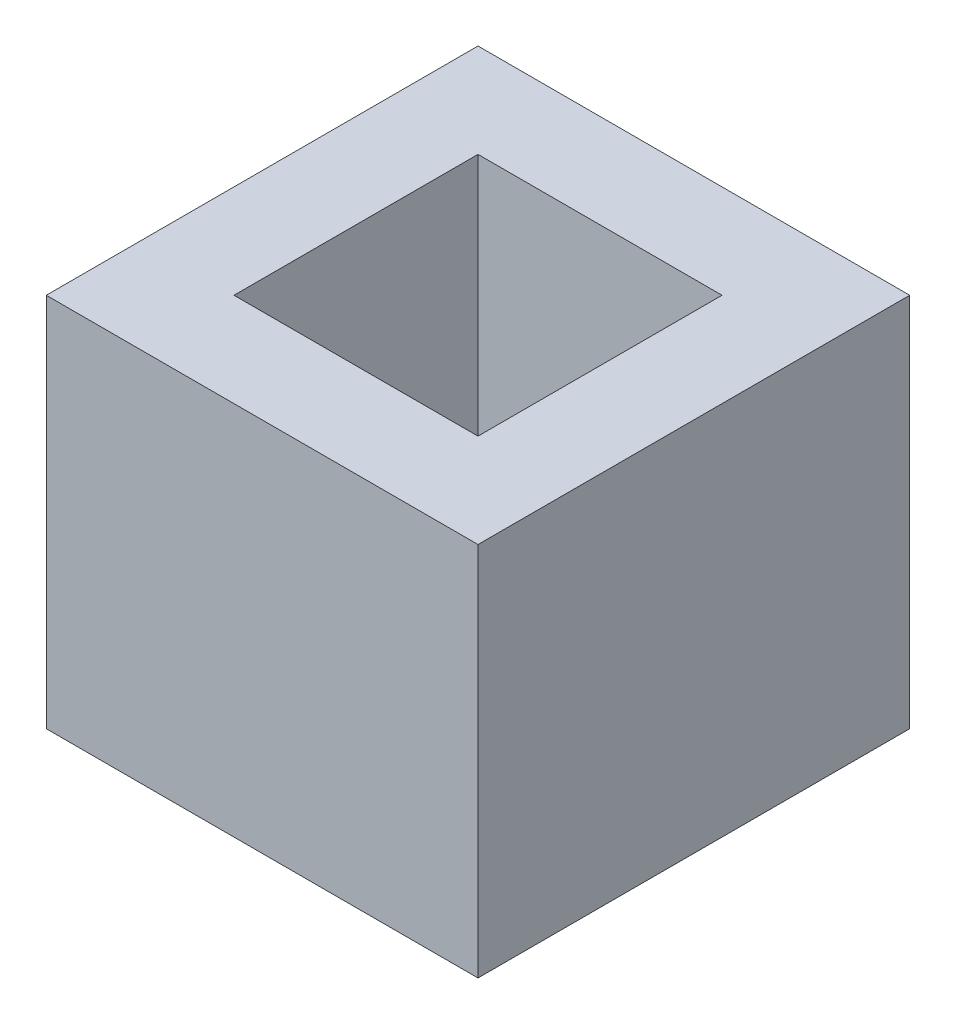
ISO-10303-21;
HEADER;
FILE_DESCRIPTION(('STEP AP214'),'2;1');
FILE_NAME('part.step','',(''),(''),'','','');
FILE_SCHEMA(('AUTOMOTIVE_DESIGN { 1 0 10303 214 1 1 1 1 }'));
ENDSEC;
DATA;
#1=APPLICATION_CONTEXT('core data for automotive mechanical design processes');
#2=APPLICATION_PROTOCOL_DEFINITION('international standard','automotive_design',2000,#1);
#3=PRODUCT_CONTEXT('',#1,'mechanical');
#4=PRODUCT('Part','Part','',(#3));
#5=PRODUCT_RELATED_PRODUCT_CATEGORY('part','',(#4));
#6=PRODUCT_DEFINITION_FORMATION('','',#4);
#7=PRODUCT_DEFINITION_CONTEXT('part definition',#1,'design');
#8=PRODUCT_DEFINITION('design','',#6,#7);
#9=PRODUCT_DEFINITION_SHAPE('','',#8);
#10=(LENGTH_UNIT() NAMED_UNIT(*) SI_UNIT(.MILLI.,.METRE.));
#11=(NAMED_UNIT(*) PLANE_ANGLE_UNIT() SI_UNIT($,.RADIAN.));
#12=(NAMED_UNIT(*) SI_UNIT($,.STERADIAN.) SOLID_ANGLE_UNIT());
#13=UNCERTAINTY_MEASURE_WITH_UNIT(LENGTH_MEASURE(1.E-05),#10,'distance_accuracy_value','');
#14=(GEOMETRIC_REPRESENTATION_CONTEXT(3) GLOBAL_UNCERTAINTY_ASSIGNED_CONTEXT((#13)) GLOBAL_UNIT_ASSIGNED_CONTEXT((#10,
#11,#12)) REPRESENTATION_CONTEXT('',''));
#15=CARTESIAN_POINT('',(0.,0.,0.));
#16=DIRECTION('',(0.,0.,1.));
#17=DIRECTION('',(1.,0.,0.));
#18=AXIS2_PLACEMENT_3D('',#15,#16,#17);
#19=CARTESIAN_POINT('',(0.,20.,0.));
#20=DIRECTION('',(0.,1.,0.));
#21=DIRECTION('',(0.,0.,1.));
#22=AXIS2_PLACEMENT_3D('',#19,#20,#21);
#23=PLANE('',#22);
#24=DIRECTION('',(0.,0.,1.));
#25=VECTOR('',#24,1.);
#26=CARTESIAN_POINT('',(0.,20.,0.));
#27=LINE('',#26,#25);
#28=CARTESIAN_POINT('',(0.,20.,0.));
#29=VERTEX_POINT('',#28);
#30=CARTESIAN_POINT('',(0.,20.,23.));
#31=VERTEX_POINT('',#30);
#32=EDGE_CURVE('E134',#29,#31,#27,.T.);
#33=ORIENTED_EDGE('',*,*,#32,.T.);
#34=DIRECTION('',(1.,0.,0.));
#35=VECTOR('',#34,1.);
#36=CARTESIAN_POINT('',(0.,20.,23.));
#37=LINE('',#36,#35);
#38=CARTESIAN_POINT('',(23.,20.,23.));
#39=VERTEX_POINT('',#38);
#40=EDGE_CURVE('E137',#31,#39,#37,.T.);
#41=ORIENTED_EDGE('',*,*,#40,.T.);
#42=DIRECTION('',(0.,0.,-1.));
#43=VECTOR('',#42,1.);
#44=CARTESIAN_POINT('',(23.,20.,0.));
#45=LINE('',#44,#43);
#46=CARTESIAN_POINT('',(23.,20.,0.));
#47=VERTEX_POINT('',#46);
#48=EDGE_CURVE('E140',#39,#47,#45,.T.);
#49=ORIENTED_EDGE('',*,*,#48,.T.);
#50=DIRECTION('',(-1.,0.,0.));
#51=VECTOR('',#50,1.);
#52=CARTESIAN_POINT('',(0.,20.,0.));
#53=LINE('',#52,#51);
#54=EDGE_CURVE('E142',#47,#29,#53,.T.);
#55=ORIENTED_EDGE('',*,*,#54,.T.);
#56=EDGE_LOOP('',(#33,#41,#49,#55));
#57=FACE_BOUND('',#56,.T.);
#58=DIRECTION('',(1.,0.,0.));
#59=VECTOR('',#58,1.);
#60=CARTESIAN_POINT('',(5.,20.,18.));
#61=LINE('',#60,#59);
#62=CARTESIAN_POINT('',(5.,20.,18.));
#63=VERTEX_POINT('',#62);
#64=CARTESIAN_POINT('',(18.,20.,18.));
#65=VERTEX_POINT('',#64);
#66=EDGE_CURVE('E106',#63,#65,#61,.T.);
#67=ORIENTED_EDGE('',*,*,#66,.F.);
#68=DIRECTION('',(0.,0.,1.));
#69=VECTOR('',#68,1.);
#70=CARTESIAN_POINT('',(5.,20.,5.));
#71=LINE('',#70,#69);
#72=CARTESIAN_POINT('',(5.,20.,5.));
#73=VERTEX_POINT('',#72);
#74=EDGE_CURVE('E98',#73,#63,#71,.T.);
#75=ORIENTED_EDGE('',*,*,#74,.F.);
#76=DIRECTION('',(-1.,0.,0.));
#77=VECTOR('',#76,1.);
#78=CARTESIAN_POINT('',(5.,20.,5.));
#79=LINE('',#78,#77);
#80=CARTESIAN_POINT('',(18.,20.,5.));
#81=VERTEX_POINT('',#80);
#82=EDGE_CURVE('E120',#81,#73,#79,.T.);
#83=ORIENTED_EDGE('',*,*,#82,.F.);
#84=DIRECTION('',(0.,0.,-1.));
#85=VECTOR('',#84,1.);
#86=CARTESIAN_POINT('',(18.,20.,5.));
#87=LINE('',#86,#85);
#88=EDGE_CURVE('E118',#65,#81,#87,.T.);
#89=ORIENTED_EDGE('',*,*,#88,.F.);
#90=EDGE_LOOP('',(#67,#75,#83,#89));
#91=FACE_BOUND('',#90,.T.);
#92=ADVANCED_FACE('F33',(#57,#91),#23,.T.);
#93=CARTESIAN_POINT('',(0.,0.,0.));
#94=DIRECTION('',(0.,1.,0.));
#95=DIRECTION('',(0.,0.,1.));
#96=AXIS2_PLACEMENT_3D('',#93,#94,#95);
#97=PLANE('',#96);
#98=DIRECTION('',(0.,0.,1.));
#99=VECTOR('',#98,1.);
#100=CARTESIAN_POINT('',(0.,0.,0.));
#101=LINE('',#100,#99);
#102=CARTESIAN_POINT('',(0.,0.,0.));
#103=VERTEX_POINT('',#102);
#104=CARTESIAN_POINT('',(0.,0.,23.));
#105=VERTEX_POINT('',#104);
#106=EDGE_CURVE('E114',#103,#105,#101,.T.);
#107=ORIENTED_EDGE('',*,*,#106,.F.);
#108=DIRECTION('',(-1.,0.,0.));
#109=VECTOR('',#108,1.);
#110=CARTESIAN_POINT('',(0.,0.,0.));
#111=LINE('',#110,#109);
#112=CARTESIAN_POINT('',(23.,0.,0.));
#113=VERTEX_POINT('',#112);
#114=EDGE_CURVE('E138',#113,#103,#111,.T.);
#115=ORIENTED_EDGE('',*,*,#114,.F.);
#116=DIRECTION('',(0.,0.,-1.));
#117=VECTOR('',#116,1.);
#118=CARTESIAN_POINT('',(23.,0.,0.));
#119=LINE('',#118,#117);
#120=CARTESIAN_POINT('',(23.,0.,23.));
#121=VERTEX_POINT('',#120);
#122=EDGE_CURVE('E149',#121,#113,#119,.T.);
#123=ORIENTED_EDGE('',*,*,#122,.F.);
#124=DIRECTION('',(1.,0.,0.));
#125=VECTOR('',#124,1.);
#126=CARTESIAN_POINT('',(0.,0.,23.));
#127=LINE('',#126,#125);
#128=EDGE_CURVE('E147',#105,#121,#127,.T.);
#129=ORIENTED_EDGE('',*,*,#128,.F.);
#130=EDGE_LOOP('',(#107,#115,#123,#129));
#131=FACE_BOUND('',#130,.T.);
#132=DIRECTION('',(0.,0.,1.));
#133=VECTOR('',#132,1.);
#134=CARTESIAN_POINT('',(5.,0.,5.));
#135=LINE('',#134,#133);
#136=CARTESIAN_POINT('',(5.,0.,5.));
#137=VERTEX_POINT('',#136);
#138=CARTESIAN_POINT('',(5.,0.,18.));
#139=VERTEX_POINT('',#138);
#140=EDGE_CURVE('E56',#137,#139,#135,.T.);
#141=ORIENTED_EDGE('',*,*,#140,.T.);
#142=DIRECTION('',(1.,0.,0.));
#143=VECTOR('',#142,1.);
#144=CARTESIAN_POINT('',(5.,0.,18.));
#145=LINE('',#144,#143);
#146=CARTESIAN_POINT('',(18.,0.,18.));
#147=VERTEX_POINT('',#146);
#148=EDGE_CURVE('E113',#139,#147,#145,.T.);
#149=ORIENTED_EDGE('',*,*,#148,.T.);
#150=DIRECTION('',(0.,0.,-1.));
#151=VECTOR('',#150,1.);
#152=CARTESIAN_POINT('',(18.,0.,5.));
#153=LINE('',#152,#151);
#154=CARTESIAN_POINT('',(18.,0.,5.));
#155=VERTEX_POINT('',#154);
#156=EDGE_CURVE('E126',#147,#155,#153,.T.);
#157=ORIENTED_EDGE('',*,*,#156,.T.);
#158=DIRECTION('',(-1.,0.,0.));
#159=VECTOR('',#158,1.);
#160=CARTESIAN_POINT('',(5.,0.,5.));
#161=LINE('',#160,#159);
#162=EDGE_CURVE('E107',#155,#137,#161,.T.);
#163=ORIENTED_EDGE('',*,*,#162,.T.);
#164=EDGE_LOOP('',(#141,#149,#157,#163));
#165=FACE_BOUND('',#164,.T.);
#166=ADVANCED_FACE('F167',(#131,#165),#97,.F.);
#167=CARTESIAN_POINT('',(0.,20.,0.));
#168=DIRECTION('',(1.,0.,0.));
#169=DIRECTION('',(0.,0.,-1.));
#170=AXIS2_PLACEMENT_3D('',#167,#168,#169);
#171=PLANE('',#170);
#172=ORIENTED_EDGE('',*,*,#106,.T.);
#173=DIRECTION('',(0.,-1.,0.));
#174=VECTOR('',#173,1.);
#175=CARTESIAN_POINT('',(0.,20.,23.));
#176=LINE('',#175,#174);
#177=EDGE_CURVE('E11',#31,#105,#176,.T.);
#178=ORIENTED_EDGE('',*,*,#177,.F.);
#179=ORIENTED_EDGE('',*,*,#32,.F.);
#180=DIRECTION('',(0.,-1.,0.));
#181=VECTOR('',#180,1.);
#182=CARTESIAN_POINT('',(0.,20.,0.));
#183=LINE('',#182,#181);
#184=EDGE_CURVE('E144',#29,#103,#183,.T.);
#185=ORIENTED_EDGE('',*,*,#184,.T.);
#186=EDGE_LOOP('',(#172,#178,#179,#185));
#187=FACE_BOUND('',#186,.T.);
#188=ADVANCED_FACE('F35',(#187),#171,.F.);
#189=CARTESIAN_POINT('',(0.,20.,23.));
#190=DIRECTION('',(0.,0.,-1.));
#191=DIRECTION('',(-1.,0.,0.));
#192=AXIS2_PLACEMENT_3D('',#189,#190,#191);
#193=PLANE('',#192);
#194=ORIENTED_EDGE('',*,*,#128,.T.);
#195=DIRECTION('',(0.,-1.,0.));
#196=VECTOR('',#195,1.);
#197=CARTESIAN_POINT('',(23.,20.,23.));
#198=LINE('',#197,#196);
#199=EDGE_CURVE('E41',#39,#121,#198,.T.);
#200=ORIENTED_EDGE('',*,*,#199,.F.);
#201=ORIENTED_EDGE('',*,*,#40,.F.);
#202=ORIENTED_EDGE('',*,*,#177,.T.);
#203=EDGE_LOOP('',(#194,#200,#201,#202));
#204=FACE_BOUND('',#203,.T.);
#205=ADVANCED_FACE('F177',(#204),#193,.F.);
#206=CARTESIAN_POINT('',(23.,20.,0.));
#207=DIRECTION('',(-1.,0.,0.));
#208=DIRECTION('',(0.,0.,1.));
#209=AXIS2_PLACEMENT_3D('',#206,#207,#208);
#210=PLANE('',#209);
#211=ORIENTED_EDGE('',*,*,#122,.T.);
#212=DIRECTION('',(0.,-1.,0.));
#213=VECTOR('',#212,1.);
#214=CARTESIAN_POINT('',(23.,20.,0.));
#215=LINE('',#214,#213);
#216=EDGE_CURVE('E154',#47,#113,#215,.T.);
#217=ORIENTED_EDGE('',*,*,#216,.F.);
#218=ORIENTED_EDGE('',*,*,#48,.F.);
#219=ORIENTED_EDGE('',*,*,#199,.T.);
#220=EDGE_LOOP('',(#211,#217,#218,#219));
#221=FACE_BOUND('',#220,.T.);
#222=ADVANCED_FACE('F161',(#221),#210,.F.);
#223=CARTESIAN_POINT('',(0.,20.,0.));
#224=DIRECTION('',(0.,0.,1.));
#225=DIRECTION('',(1.,0.,0.));
#226=AXIS2_PLACEMENT_3D('',#223,#224,#225);
#227=PLANE('',#226);
#228=ORIENTED_EDGE('',*,*,#114,.T.);
#229=ORIENTED_EDGE('',*,*,#184,.F.);
#230=ORIENTED_EDGE('',*,*,#54,.F.);
#231=ORIENTED_EDGE('',*,*,#216,.T.);
#232=EDGE_LOOP('',(#228,#229,#230,#231));
#233=FACE_BOUND('',#232,.T.);
#234=ADVANCED_FACE('F171',(#233),#227,.F.);
#235=CARTESIAN_POINT('',(5.,20.,5.));
#236=DIRECTION('',(1.,0.,0.));
#237=DIRECTION('',(0.,0.,-1.));
#238=AXIS2_PLACEMENT_3D('',#235,#236,#237);
#239=PLANE('',#238);
#240=ORIENTED_EDGE('',*,*,#140,.F.);
#241=DIRECTION('',(0.,-1.,0.));
#242=VECTOR('',#241,1.);
#243=CARTESIAN_POINT('',(5.,20.,5.));
#244=LINE('',#243,#242);
#245=EDGE_CURVE('E102',#73,#137,#244,.T.);
#246=ORIENTED_EDGE('',*,*,#245,.F.);
#247=ORIENTED_EDGE('',*,*,#74,.T.);
#248=DIRECTION('',(0.,-1.,0.));
#249=VECTOR('',#248,1.);
#250=CARTESIAN_POINT('',(5.,20.,18.));
#251=LINE('',#250,#249);
#252=EDGE_CURVE('E101',#63,#139,#251,.T.);
#253=ORIENTED_EDGE('',*,*,#252,.T.);
#254=EDGE_LOOP('',(#240,#246,#247,#253));
#255=FACE_BOUND('',#254,.T.);
#256=ADVANCED_FACE('F100',(#255),#239,.T.);
#257=CARTESIAN_POINT('',(5.,20.,18.));
#258=DIRECTION('',(0.,0.,-1.));
#259=DIRECTION('',(-1.,0.,0.));
#260=AXIS2_PLACEMENT_3D('',#257,#258,#259);
#261=PLANE('',#260);
#262=ORIENTED_EDGE('',*,*,#148,.F.);
#263=ORIENTED_EDGE('',*,*,#252,.F.);
#264=ORIENTED_EDGE('',*,*,#66,.T.);
#265=DIRECTION('',(0.,-1.,0.));
#266=VECTOR('',#265,1.);
#267=CARTESIAN_POINT('',(18.,20.,18.));
#268=LINE('',#267,#266);
#269=EDGE_CURVE('E115',#65,#147,#268,.T.);
#270=ORIENTED_EDGE('',*,*,#269,.T.);
#271=EDGE_LOOP('',(#262,#263,#264,#270));
#272=FACE_BOUND('',#271,.T.);
#273=ADVANCED_FACE('F110',(#272),#261,.T.);
#274=CARTESIAN_POINT('',(18.,20.,5.));
#275=DIRECTION('',(-1.,0.,0.));
#276=DIRECTION('',(0.,0.,1.));
#277=AXIS2_PLACEMENT_3D('',#274,#275,#276);
#278=PLANE('',#277);
#279=ORIENTED_EDGE('',*,*,#156,.F.);
#280=ORIENTED_EDGE('',*,*,#269,.F.);
#281=ORIENTED_EDGE('',*,*,#88,.T.);
#282=DIRECTION('',(0.,-1.,0.));
#283=VECTOR('',#282,1.);
#284=CARTESIAN_POINT('',(18.,20.,5.));
#285=LINE('',#284,#283);
#286=EDGE_CURVE('E48',#81,#155,#285,.T.);
#287=ORIENTED_EDGE('',*,*,#286,.T.);
#288=EDGE_LOOP('',(#279,#280,#281,#287));
#289=FACE_BOUND('',#288,.T.);
#290=ADVANCED_FACE('F200',(#289),#278,.T.);
#291=CARTESIAN_POINT('',(5.,20.,5.));
#292=DIRECTION('',(0.,0.,1.));
#293=DIRECTION('',(1.,0.,0.));
#294=AXIS2_PLACEMENT_3D('',#291,#292,#293);
#295=PLANE('',#294);
#296=ORIENTED_EDGE('',*,*,#162,.F.);
#297=ORIENTED_EDGE('',*,*,#286,.F.);
#298=ORIENTED_EDGE('',*,*,#82,.T.);
#299=ORIENTED_EDGE('',*,*,#245,.T.);
#300=EDGE_LOOP('',(#296,#297,#298,#299));
#301=FACE_BOUND('',#300,.T.);
#302=ADVANCED_FACE('F204',(#301),#295,.T.);
#303=CLOSED_SHELL('',(#92,#166,#188,#205,#222,#234,#256,#273,#290,#302));
#304=MANIFOLD_SOLID_BREP('B2',#303);
#305=ADVANCED_BREP_SHAPE_REPRESENTATION('',(#18,#304),#14);
#306=SHAPE_DEFINITION_REPRESENTATION(#9,#305);
ENDSEC;
END-ISO-10303-21;
